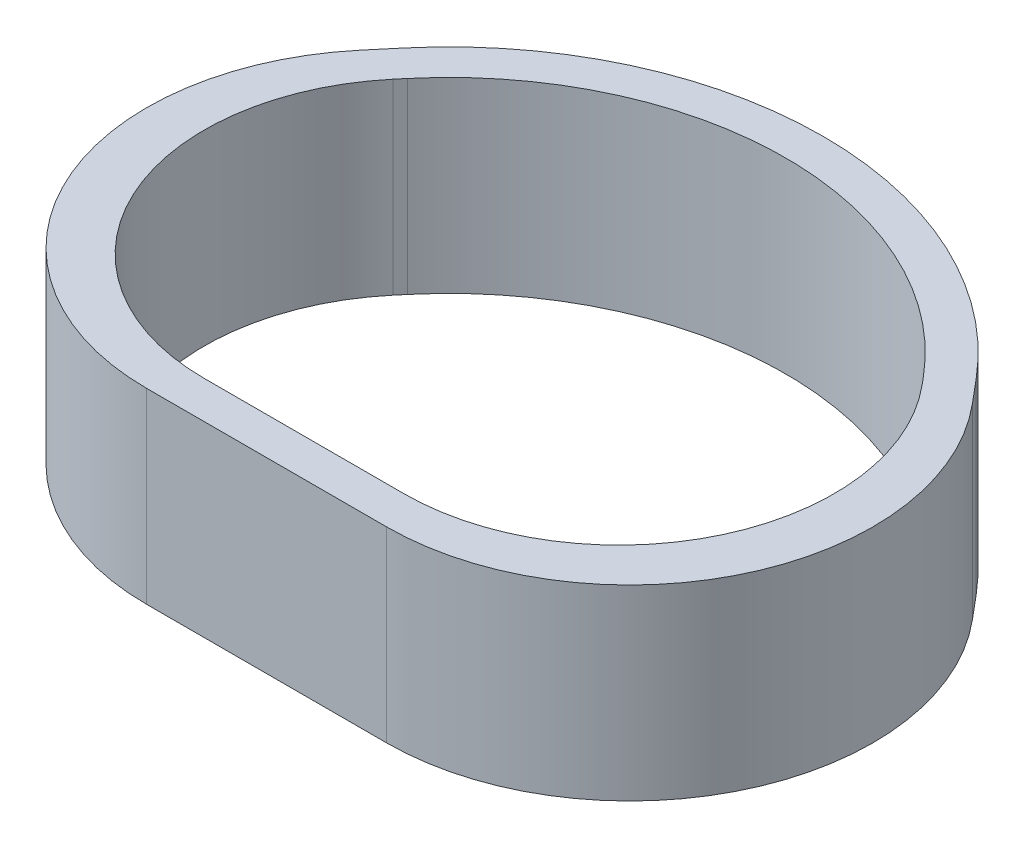
ISO-10303-21;
HEADER;
FILE_DESCRIPTION(('STEP AP214'),'2;1');
FILE_NAME('part.step','',(''),(''),'','','');
FILE_SCHEMA(('AUTOMOTIVE_DESIGN { 1 0 10303 214 1 1 1 1 }'));
ENDSEC;
DATA;
#1=APPLICATION_CONTEXT('core data for automotive mechanical design processes');
#2=APPLICATION_PROTOCOL_DEFINITION('international standard','automotive_design',2000,#1);
#3=PRODUCT_CONTEXT('',#1,'mechanical');
#4=PRODUCT('Part','Part','',(#3));
#5=PRODUCT_RELATED_PRODUCT_CATEGORY('part','',(#4));
#6=PRODUCT_DEFINITION_FORMATION('','',#4);
#7=PRODUCT_DEFINITION_CONTEXT('part definition',#1,'design');
#8=PRODUCT_DEFINITION('design','',#6,#7);
#9=PRODUCT_DEFINITION_SHAPE('','',#8);
#10=(LENGTH_UNIT() NAMED_UNIT(*) SI_UNIT(.MILLI.,.METRE.));
#11=(NAMED_UNIT(*) PLANE_ANGLE_UNIT() SI_UNIT($,.RADIAN.));
#12=(NAMED_UNIT(*) SI_UNIT($,.STERADIAN.) SOLID_ANGLE_UNIT());
#13=UNCERTAINTY_MEASURE_WITH_UNIT(LENGTH_MEASURE(1.E-05),#10,'distance_accuracy_value','');
#14=(GEOMETRIC_REPRESENTATION_CONTEXT(3) GLOBAL_UNCERTAINTY_ASSIGNED_CONTEXT((#13)) GLOBAL_UNIT_ASSIGNED_CONTEXT((#10,
#11,#12)) REPRESENTATION_CONTEXT('',''));
#15=CARTESIAN_POINT('',(0.,0.,0.));
#16=DIRECTION('',(0.,0.,1.));
#17=DIRECTION('',(1.,0.,0.));
#18=AXIS2_PLACEMENT_3D('',#15,#16,#17);
#19=CARTESIAN_POINT('',(-64.104238743913,100.,-110.));
#20=DIRECTION('',(0.,-1.,0.));
#21=DIRECTION('',(0.,0.,-1.));
#22=AXIS2_PLACEMENT_3D('',#19,#20,#21);
#23=PLANE('',#22);
#24=CARTESIAN_POINT('',(-64.104238743913,100.,-110.));
#25=DIRECTION('',(0.,1.,0.));
#26=DIRECTION('',(0.,0.,-1.));
#27=AXIS2_PLACEMENT_3D('',#24,#25,#26);
#28=CIRCLE('',#27,130.000000000018);
#29=CARTESIAN_POINT('',(-163.690016349428,100.,-193.56238925925));
#30=VERTEX_POINT('',#29);
#31=CARTESIAN_POINT('',(-64.1042387439607,100.,20.));
#32=VERTEX_POINT('',#31);
#33=EDGE_CURVE('E177',#30,#32,#28,.T.);
#34=ORIENTED_EDGE('',*,*,#33,.T.);
#35=DIRECTION('',(1.,0.,0.));
#36=VECTOR('',#35,1.);
#37=CARTESIAN_POINT('',(64.1042387439492,100.,20.));
#38=LINE('',#37,#36);
#39=CARTESIAN_POINT('',(64.1042387439492,100.,20.));
#40=VERTEX_POINT('',#39);
#41=EDGE_CURVE('E180',#32,#40,#38,.T.);
#42=ORIENTED_EDGE('',*,*,#41,.T.);
#43=CARTESIAN_POINT('',(64.1042387439492,100.,-110.));
#44=DIRECTION('',(0.,1.,0.));
#45=DIRECTION('',(0.,0.,-1.));
#46=AXIS2_PLACEMENT_3D('',#43,#44,#45);
#47=CIRCLE('',#46,130.);
#48=CARTESIAN_POINT('',(163.690016349416,100.,-193.56238925925));
#49=VERTEX_POINT('',#48);
#50=EDGE_CURVE('E183',#40,#49,#47,.T.);
#51=ORIENTED_EDGE('',*,*,#50,.T.);
#52=DIRECTION('',(-0.642787609686539,0.,-0.766044443118979));
#53=VECTOR('',#52,1.);
#54=CARTESIAN_POINT('',(153.20888862379,100.,-206.053310880704));
#55=LINE('',#54,#53);
#56=CARTESIAN_POINT('',(153.20888862379,100.,-206.053310880704));
#57=VERTEX_POINT('',#56);
#58=EDGE_CURVE('E185',#49,#57,#55,.T.);
#59=ORIENTED_EDGE('',*,*,#58,.T.);
#60=CARTESIAN_POINT('',(-5.85078860360078E-12,100.,-77.4957889433964));
#61=DIRECTION('',(0.,1.,0.));
#62=DIRECTION('',(0.,0.,1.));
#63=AXIS2_PLACEMENT_3D('',#60,#61,#62);
#64=CIRCLE('',#63,200.);
#65=CARTESIAN_POINT('',(-153.208888623802,100.,-206.053310880704));
#66=VERTEX_POINT('',#65);
#67=EDGE_CURVE('E187',#57,#66,#64,.T.);
#68=ORIENTED_EDGE('',*,*,#67,.T.);
#69=DIRECTION('',(-0.642787609686539,0.,0.766044443118978));
#70=VECTOR('',#69,1.);
#71=CARTESIAN_POINT('',(-163.690016349428,100.,-193.56238925925));
#72=LINE('',#71,#70);
#73=EDGE_CURVE('E189',#66,#30,#72,.T.);
#74=ORIENTED_EDGE('',*,*,#73,.T.);
#75=EDGE_LOOP('',(#34,#42,#51,#59,#68,#74));
#76=FACE_BOUND('',#75,.T.);
#77=CARTESIAN_POINT('',(0.,100.,-77.4957889433895));
#78=DIRECTION('',(0.,1.,0.));
#79=DIRECTION('',(0.,0.,1.));
#80=AXIS2_PLACEMENT_3D('',#77,#78,#79);
#81=CIRCLE('',#80,180.);
#82=CARTESIAN_POINT('',(137.887999761416,100.,-193.197558686966));
#83=VERTEX_POINT('',#82);
#84=CARTESIAN_POINT('',(-137.887999761416,100.,-193.197558686966));
#85=VERTEX_POINT('',#84);
#86=EDGE_CURVE('E126',#83,#85,#81,.T.);
#87=ORIENTED_EDGE('',*,*,#86,.F.);
#88=DIRECTION('',(-0.642787609686538,0.,-0.766044443118979));
#89=VECTOR('',#88,1.);
#90=CARTESIAN_POINT('',(141.476815100084,100.,-188.920575113952));
#91=LINE('',#90,#89);
#92=CARTESIAN_POINT('',(141.476815100084,100.,-188.920575113952));
#93=VERTEX_POINT('',#92);
#94=EDGE_CURVE('E155',#93,#83,#91,.T.);
#95=ORIENTED_EDGE('',*,*,#94,.F.);
#96=CARTESIAN_POINT('',(53.3817041414014,100.,-115.));
#97=DIRECTION('',(0.,1.,0.));
#98=DIRECTION('',(0.,0.,-1.));
#99=AXIS2_PLACEMENT_3D('',#96,#97,#98);
#100=CIRCLE('',#99,115.);
#101=CARTESIAN_POINT('',(53.3817041414014,100.,0.));
#102=VERTEX_POINT('',#101);
#103=EDGE_CURVE('E153',#102,#93,#100,.T.);
#104=ORIENTED_EDGE('',*,*,#103,.F.);
#105=DIRECTION('',(1.,0.,0.));
#106=VECTOR('',#105,1.);
#107=CARTESIAN_POINT('',(-53.3817041414013,100.,0.));
#108=LINE('',#107,#106);
#109=CARTESIAN_POINT('',(-53.3817041414013,100.,0.));
#110=VERTEX_POINT('',#109);
#111=EDGE_CURVE('E149',#110,#102,#108,.T.);
#112=ORIENTED_EDGE('',*,*,#111,.F.);
#113=CARTESIAN_POINT('',(-53.3817041414014,100.,-115.));
#114=DIRECTION('',(0.,1.,0.));
#115=DIRECTION('',(0.,0.,1.));
#116=AXIS2_PLACEMENT_3D('',#113,#114,#115);
#117=CIRCLE('',#116,115.);
#118=CARTESIAN_POINT('',(-141.476815100084,100.,-188.920575113952));
#119=VERTEX_POINT('',#118);
#120=EDGE_CURVE('E147',#119,#110,#117,.T.);
#121=ORIENTED_EDGE('',*,*,#120,.F.);
#122=DIRECTION('',(-0.642787609686538,0.,0.766044443118979));
#123=VECTOR('',#122,1.);
#124=CARTESIAN_POINT('',(-137.887999761416,100.,-193.197558686966));
#125=LINE('',#124,#123);
#126=EDGE_CURVE('E134',#85,#119,#125,.T.);
#127=ORIENTED_EDGE('',*,*,#126,.F.);
#128=EDGE_LOOP('',(#87,#95,#104,#112,#121,#127));
#129=FACE_BOUND('',#128,.T.);
#130=ADVANCED_FACE('F37',(#76,#129),#23,.F.);
#131=CARTESIAN_POINT('',(-64.104238743913,0.,-110.));
#132=DIRECTION('',(0.,-1.,0.));
#133=DIRECTION('',(0.,0.,-1.));
#134=AXIS2_PLACEMENT_3D('',#131,#132,#133);
#135=PLANE('',#134);
#136=CARTESIAN_POINT('',(-64.104238743913,0.,-110.));
#137=DIRECTION('',(0.,1.,0.));
#138=DIRECTION('',(0.,0.,-1.));
#139=AXIS2_PLACEMENT_3D('',#136,#137,#138);
#140=CIRCLE('',#139,130.000000000018);
#141=CARTESIAN_POINT('',(-163.690016349428,0.,-193.56238925925));
#142=VERTEX_POINT('',#141);
#143=CARTESIAN_POINT('',(-64.1042387439607,0.,20.));
#144=VERTEX_POINT('',#143);
#145=EDGE_CURVE('E142',#142,#144,#140,.T.);
#146=ORIENTED_EDGE('',*,*,#145,.F.);
#147=DIRECTION('',(-0.642787609686539,0.,0.766044443118978));
#148=VECTOR('',#147,1.);
#149=CARTESIAN_POINT('',(-163.690016349428,0.,-193.56238925925));
#150=LINE('',#149,#148);
#151=CARTESIAN_POINT('',(-153.208888623802,0.,-206.053310880704));
#152=VERTEX_POINT('',#151);
#153=EDGE_CURVE('E181',#152,#142,#150,.T.);
#154=ORIENTED_EDGE('',*,*,#153,.F.);
#155=CARTESIAN_POINT('',(-5.85078860360078E-12,0.,-77.4957889433964));
#156=DIRECTION('',(0.,1.,0.));
#157=DIRECTION('',(0.,0.,1.));
#158=AXIS2_PLACEMENT_3D('',#155,#156,#157);
#159=CIRCLE('',#158,200.);
#160=CARTESIAN_POINT('',(153.20888862379,0.,-206.053310880704));
#161=VERTEX_POINT('',#160);
#162=EDGE_CURVE('E200',#161,#152,#159,.T.);
#163=ORIENTED_EDGE('',*,*,#162,.F.);
#164=DIRECTION('',(-0.642787609686539,0.,-0.766044443118979));
#165=VECTOR('',#164,1.);
#166=CARTESIAN_POINT('',(153.20888862379,0.,-206.053310880704));
#167=LINE('',#166,#165);
#168=CARTESIAN_POINT('',(163.690016349416,0.,-193.56238925925));
#169=VERTEX_POINT('',#168);
#170=EDGE_CURVE('E198',#169,#161,#167,.T.);
#171=ORIENTED_EDGE('',*,*,#170,.F.);
#172=CARTESIAN_POINT('',(64.1042387439492,0.,-110.));
#173=DIRECTION('',(0.,1.,0.));
#174=DIRECTION('',(0.,0.,-1.));
#175=AXIS2_PLACEMENT_3D('',#172,#173,#174);
#176=CIRCLE('',#175,130.);
#177=CARTESIAN_POINT('',(64.1042387439492,0.,20.));
#178=VERTEX_POINT('',#177);
#179=EDGE_CURVE('E196',#178,#169,#176,.T.);
#180=ORIENTED_EDGE('',*,*,#179,.F.);
#181=DIRECTION('',(1.,0.,0.));
#182=VECTOR('',#181,1.);
#183=CARTESIAN_POINT('',(64.1042387439492,0.,20.));
#184=LINE('',#183,#182);
#185=EDGE_CURVE('E194',#144,#178,#184,.T.);
#186=ORIENTED_EDGE('',*,*,#185,.F.);
#187=EDGE_LOOP('',(#146,#154,#163,#171,#180,#186));
#188=FACE_BOUND('',#187,.T.);
#189=DIRECTION('',(-0.642787609686538,0.,-0.766044443118979));
#190=VECTOR('',#189,1.);
#191=CARTESIAN_POINT('',(141.476815100084,0.,-188.920575113952));
#192=LINE('',#191,#190);
#193=CARTESIAN_POINT('',(141.476815100084,0.,-188.920575113952));
#194=VERTEX_POINT('',#193);
#195=CARTESIAN_POINT('',(137.887999761416,0.,-193.197558686966));
#196=VERTEX_POINT('',#195);
#197=EDGE_CURVE('E135',#194,#196,#192,.T.);
#198=ORIENTED_EDGE('',*,*,#197,.T.);
#199=CARTESIAN_POINT('',(0.,0.,-77.4957889433895));
#200=DIRECTION('',(0.,1.,0.));
#201=DIRECTION('',(0.,0.,1.));
#202=AXIS2_PLACEMENT_3D('',#199,#200,#201);
#203=CIRCLE('',#202,180.);
#204=CARTESIAN_POINT('',(-137.887999761416,0.,-193.197558686966));
#205=VERTEX_POINT('',#204);
#206=EDGE_CURVE('E60',#196,#205,#203,.T.);
#207=ORIENTED_EDGE('',*,*,#206,.T.);
#208=DIRECTION('',(-0.642787609686538,0.,0.766044443118979));
#209=VECTOR('',#208,1.);
#210=CARTESIAN_POINT('',(-137.887999761416,0.,-193.197558686966));
#211=LINE('',#210,#209);
#212=CARTESIAN_POINT('',(-141.476815100084,0.,-188.920575113952));
#213=VERTEX_POINT('',#212);
#214=EDGE_CURVE('E141',#205,#213,#211,.T.);
#215=ORIENTED_EDGE('',*,*,#214,.T.);
#216=CARTESIAN_POINT('',(-53.3817041414014,0.,-115.));
#217=DIRECTION('',(0.,1.,0.));
#218=DIRECTION('',(0.,0.,1.));
#219=AXIS2_PLACEMENT_3D('',#216,#217,#218);
#220=CIRCLE('',#219,115.);
#221=CARTESIAN_POINT('',(-53.3817041414013,0.,0.));
#222=VERTEX_POINT('',#221);
#223=EDGE_CURVE('E159',#213,#222,#220,.T.);
#224=ORIENTED_EDGE('',*,*,#223,.T.);
#225=DIRECTION('',(1.,0.,0.));
#226=VECTOR('',#225,1.);
#227=CARTESIAN_POINT('',(-53.3817041414013,0.,0.));
#228=LINE('',#227,#226);
#229=CARTESIAN_POINT('',(53.3817041414014,0.,0.));
#230=VERTEX_POINT('',#229);
#231=EDGE_CURVE('E162',#222,#230,#228,.T.);
#232=ORIENTED_EDGE('',*,*,#231,.T.);
#233=CARTESIAN_POINT('',(53.3817041414014,0.,-115.));
#234=DIRECTION('',(0.,1.,0.));
#235=DIRECTION('',(0.,0.,-1.));
#236=AXIS2_PLACEMENT_3D('',#233,#234,#235);
#237=CIRCLE('',#236,115.);
#238=EDGE_CURVE('E165',#230,#194,#237,.T.);
#239=ORIENTED_EDGE('',*,*,#238,.T.);
#240=EDGE_LOOP('',(#198,#207,#215,#224,#232,#239));
#241=FACE_BOUND('',#240,.T.);
#242=ADVANCED_FACE('F224',(#188,#241),#135,.T.);
#243=CARTESIAN_POINT('',(-64.104238743913,100.,-110.));
#244=DIRECTION('',(0.,-1.,0.));
#245=DIRECTION('',(0.,0.,-1.));
#246=AXIS2_PLACEMENT_3D('',#243,#244,#245);
#247=CYLINDRICAL_SURFACE('',#246,130.000000000018);
#248=ORIENTED_EDGE('',*,*,#145,.T.);
#249=DIRECTION('',(0.,-1.,0.));
#250=VECTOR('',#249,1.);
#251=CARTESIAN_POINT('',(-64.1042387439607,100.,20.));
#252=LINE('',#251,#250);
#253=EDGE_CURVE('E11',#32,#144,#252,.T.);
#254=ORIENTED_EDGE('',*,*,#253,.F.);
#255=ORIENTED_EDGE('',*,*,#33,.F.);
#256=DIRECTION('',(0.,-1.,0.));
#257=VECTOR('',#256,1.);
#258=CARTESIAN_POINT('',(-163.690016349428,100.,-193.56238925925));
#259=LINE('',#258,#257);
#260=EDGE_CURVE('E191',#30,#142,#259,.T.);
#261=ORIENTED_EDGE('',*,*,#260,.T.);
#262=EDGE_LOOP('',(#248,#254,#255,#261));
#263=FACE_BOUND('',#262,.T.);
#264=ADVANCED_FACE('F39',(#263),#247,.T.);
#265=CARTESIAN_POINT('',(64.1042387439492,100.,20.));
#266=DIRECTION('',(0.,0.,-1.));
#267=DIRECTION('',(-1.,0.,0.));
#268=AXIS2_PLACEMENT_3D('',#265,#266,#267);
#269=PLANE('',#268);
#270=ORIENTED_EDGE('',*,*,#185,.T.);
#271=DIRECTION('',(0.,-1.,0.));
#272=VECTOR('',#271,1.);
#273=CARTESIAN_POINT('',(64.1042387439492,100.,20.));
#274=LINE('',#273,#272);
#275=EDGE_CURVE('E45',#40,#178,#274,.T.);
#276=ORIENTED_EDGE('',*,*,#275,.F.);
#277=ORIENTED_EDGE('',*,*,#41,.F.);
#278=ORIENTED_EDGE('',*,*,#253,.T.);
#279=EDGE_LOOP('',(#270,#276,#277,#278));
#280=FACE_BOUND('',#279,.T.);
#281=ADVANCED_FACE('F241',(#280),#269,.F.);
#282=CARTESIAN_POINT('',(64.1042387439492,100.,-110.));
#283=DIRECTION('',(0.,-1.,0.));
#284=DIRECTION('',(0.,0.,-1.));
#285=AXIS2_PLACEMENT_3D('',#282,#283,#284);
#286=CYLINDRICAL_SURFACE('',#285,130.);
#287=ORIENTED_EDGE('',*,*,#179,.T.);
#288=DIRECTION('',(0.,-1.,0.));
#289=VECTOR('',#288,1.);
#290=CARTESIAN_POINT('',(163.690016349416,100.,-193.56238925925));
#291=LINE('',#290,#289);
#292=EDGE_CURVE('E211',#49,#169,#291,.T.);
#293=ORIENTED_EDGE('',*,*,#292,.F.);
#294=ORIENTED_EDGE('',*,*,#50,.F.);
#295=ORIENTED_EDGE('',*,*,#275,.T.);
#296=EDGE_LOOP('',(#287,#293,#294,#295));
#297=FACE_BOUND('',#296,.T.);
#298=ADVANCED_FACE('F218',(#297),#286,.T.);
#299=CARTESIAN_POINT('',(153.20888862379,100.,-206.053310880704));
#300=DIRECTION('',(-0.766044443118979,0.,0.642787609686539));
#301=DIRECTION('',(0.642787609686539,0.,0.766044443118979));
#302=AXIS2_PLACEMENT_3D('',#299,#300,#301);
#303=PLANE('',#302);
#304=ORIENTED_EDGE('',*,*,#170,.T.);
#305=DIRECTION('',(0.,-1.,0.));
#306=VECTOR('',#305,1.);
#307=CARTESIAN_POINT('',(153.20888862379,100.,-206.053310880704));
#308=LINE('',#307,#306);
#309=EDGE_CURVE('E208',#57,#161,#308,.T.);
#310=ORIENTED_EDGE('',*,*,#309,.F.);
#311=ORIENTED_EDGE('',*,*,#58,.F.);
#312=ORIENTED_EDGE('',*,*,#292,.T.);
#313=EDGE_LOOP('',(#304,#310,#311,#312));
#314=FACE_BOUND('',#313,.T.);
#315=ADVANCED_FACE('F230',(#314),#303,.F.);
#316=CARTESIAN_POINT('',(-5.85078860360078E-12,100.,-77.4957889433964));
#317=DIRECTION('',(0.,-1.,0.));
#318=DIRECTION('',(0.,0.,-1.));
#319=AXIS2_PLACEMENT_3D('',#316,#317,#318);
#320=CYLINDRICAL_SURFACE('',#319,200.);
#321=ORIENTED_EDGE('',*,*,#162,.T.);
#322=DIRECTION('',(0.,-1.,0.));
#323=VECTOR('',#322,1.);
#324=CARTESIAN_POINT('',(-153.208888623802,100.,-206.053310880704));
#325=LINE('',#324,#323);
#326=EDGE_CURVE('E205',#66,#152,#325,.T.);
#327=ORIENTED_EDGE('',*,*,#326,.F.);
#328=ORIENTED_EDGE('',*,*,#67,.F.);
#329=ORIENTED_EDGE('',*,*,#309,.T.);
#330=EDGE_LOOP('',(#321,#327,#328,#329));
#331=FACE_BOUND('',#330,.T.);
#332=ADVANCED_FACE('F234',(#331),#320,.T.);
#333=CARTESIAN_POINT('',(-163.690016349428,100.,-193.56238925925));
#334=DIRECTION('',(0.766044443118978,0.,0.642787609686539));
#335=DIRECTION('',(0.642787609686539,0.,-0.766044443118978));
#336=AXIS2_PLACEMENT_3D('',#333,#334,#335);
#337=PLANE('',#336);
#338=ORIENTED_EDGE('',*,*,#153,.T.);
#339=ORIENTED_EDGE('',*,*,#260,.F.);
#340=ORIENTED_EDGE('',*,*,#73,.F.);
#341=ORIENTED_EDGE('',*,*,#326,.T.);
#342=EDGE_LOOP('',(#338,#339,#340,#341));
#343=FACE_BOUND('',#342,.T.);
#344=ADVANCED_FACE('F244',(#343),#337,.F.);
#345=CARTESIAN_POINT('',(0.,100.,-77.4957889433895));
#346=DIRECTION('',(0.,-1.,0.));
#347=DIRECTION('',(0.,0.,-1.));
#348=AXIS2_PLACEMENT_3D('',#345,#346,#347);
#349=CYLINDRICAL_SURFACE('',#348,180.);
#350=ORIENTED_EDGE('',*,*,#206,.F.);
#351=DIRECTION('',(0.,-1.,0.));
#352=VECTOR('',#351,1.);
#353=CARTESIAN_POINT('',(137.887999761416,100.,-193.197558686966));
#354=LINE('',#353,#352);
#355=EDGE_CURVE('E130',#83,#196,#354,.T.);
#356=ORIENTED_EDGE('',*,*,#355,.F.);
#357=ORIENTED_EDGE('',*,*,#86,.T.);
#358=DIRECTION('',(0.,-1.,0.));
#359=VECTOR('',#358,1.);
#360=CARTESIAN_POINT('',(-137.887999761416,100.,-193.197558686966));
#361=LINE('',#360,#359);
#362=EDGE_CURVE('E129',#85,#205,#361,.T.);
#363=ORIENTED_EDGE('',*,*,#362,.T.);
#364=EDGE_LOOP('',(#350,#356,#357,#363));
#365=FACE_BOUND('',#364,.T.);
#366=ADVANCED_FACE('F128',(#365),#349,.F.);
#367=CARTESIAN_POINT('',(-137.887999761416,100.,-193.197558686966));
#368=DIRECTION('',(0.766044443118979,0.,0.642787609686538));
#369=DIRECTION('',(0.642787609686538,0.,-0.766044443118979));
#370=AXIS2_PLACEMENT_3D('',#367,#368,#369);
#371=PLANE('',#370);
#372=ORIENTED_EDGE('',*,*,#214,.F.);
#373=ORIENTED_EDGE('',*,*,#362,.F.);
#374=ORIENTED_EDGE('',*,*,#126,.T.);
#375=DIRECTION('',(0.,-1.,0.));
#376=VECTOR('',#375,1.);
#377=CARTESIAN_POINT('',(-141.476815100084,100.,-188.920575113952));
#378=LINE('',#377,#376);
#379=EDGE_CURVE('E143',#119,#213,#378,.T.);
#380=ORIENTED_EDGE('',*,*,#379,.T.);
#381=EDGE_LOOP('',(#372,#373,#374,#380));
#382=FACE_BOUND('',#381,.T.);
#383=ADVANCED_FACE('F138',(#382),#371,.T.);
#384=CARTESIAN_POINT('',(-53.3817041414014,100.,-115.));
#385=DIRECTION('',(0.,-1.,0.));
#386=DIRECTION('',(0.,0.,-1.));
#387=AXIS2_PLACEMENT_3D('',#384,#385,#386);
#388=CYLINDRICAL_SURFACE('',#387,115.);
#389=ORIENTED_EDGE('',*,*,#223,.F.);
#390=ORIENTED_EDGE('',*,*,#379,.F.);
#391=ORIENTED_EDGE('',*,*,#120,.T.);
#392=DIRECTION('',(0.,-1.,0.));
#393=VECTOR('',#392,1.);
#394=CARTESIAN_POINT('',(-53.3817041414013,100.,0.));
#395=LINE('',#394,#393);
#396=EDGE_CURVE('E174',#110,#222,#395,.T.);
#397=ORIENTED_EDGE('',*,*,#396,.T.);
#398=EDGE_LOOP('',(#389,#390,#391,#397));
#399=FACE_BOUND('',#398,.T.);
#400=ADVANCED_FACE('F262',(#399),#388,.F.);
#401=CARTESIAN_POINT('',(-53.3817041414013,100.,0.));
#402=DIRECTION('',(0.,0.,-1.));
#403=DIRECTION('',(-1.,0.,0.));
#404=AXIS2_PLACEMENT_3D('',#401,#402,#403);
#405=PLANE('',#404);
#406=ORIENTED_EDGE('',*,*,#231,.F.);
#407=ORIENTED_EDGE('',*,*,#396,.F.);
#408=ORIENTED_EDGE('',*,*,#111,.T.);
#409=DIRECTION('',(0.,-1.,0.));
#410=VECTOR('',#409,1.);
#411=CARTESIAN_POINT('',(53.3817041414014,100.,0.));
#412=LINE('',#411,#410);
#413=EDGE_CURVE('E172',#102,#230,#412,.T.);
#414=ORIENTED_EDGE('',*,*,#413,.T.);
#415=EDGE_LOOP('',(#406,#407,#408,#414));
#416=FACE_BOUND('',#415,.T.);
#417=ADVANCED_FACE('F265',(#416),#405,.T.);
#418=CARTESIAN_POINT('',(53.3817041414014,100.,-115.));
#419=DIRECTION('',(0.,-1.,0.));
#420=DIRECTION('',(0.,0.,-1.));
#421=AXIS2_PLACEMENT_3D('',#418,#419,#420);
#422=CYLINDRICAL_SURFACE('',#421,115.);
#423=ORIENTED_EDGE('',*,*,#238,.F.);
#424=ORIENTED_EDGE('',*,*,#413,.F.);
#425=ORIENTED_EDGE('',*,*,#103,.T.);
#426=DIRECTION('',(0.,-1.,0.));
#427=VECTOR('',#426,1.);
#428=CARTESIAN_POINT('',(141.476815100084,100.,-188.920575113952));
#429=LINE('',#428,#427);
#430=EDGE_CURVE('E52',#93,#194,#429,.T.);
#431=ORIENTED_EDGE('',*,*,#430,.T.);
#432=EDGE_LOOP('',(#423,#424,#425,#431));
#433=FACE_BOUND('',#432,.T.);
#434=ADVANCED_FACE('F269',(#433),#422,.F.);
#435=CARTESIAN_POINT('',(141.476815100084,100.,-188.920575113952));
#436=DIRECTION('',(-0.766044443118979,0.,0.642787609686539));
#437=DIRECTION('',(0.642787609686538,0.,0.766044443118979));
#438=AXIS2_PLACEMENT_3D('',#435,#436,#437);
#439=PLANE('',#438);
#440=ORIENTED_EDGE('',*,*,#197,.F.);
#441=ORIENTED_EDGE('',*,*,#430,.F.);
#442=ORIENTED_EDGE('',*,*,#94,.T.);
#443=ORIENTED_EDGE('',*,*,#355,.T.);
#444=EDGE_LOOP('',(#440,#441,#442,#443));
#445=FACE_BOUND('',#444,.T.);
#446=ADVANCED_FACE('F273',(#445),#439,.T.);
#447=CLOSED_SHELL('',(#130,#242,#264,#281,#298,#315,#332,#344,#366,#383,#400,#417,#434,#446));
#448=MANIFOLD_SOLID_BREP('B2',#447);
#449=ADVANCED_BREP_SHAPE_REPRESENTATION('',(#18,#448),#14);
#450=SHAPE_DEFINITION_REPRESENTATION(#9,#449);
ENDSEC;
END-ISO-10303-21;
